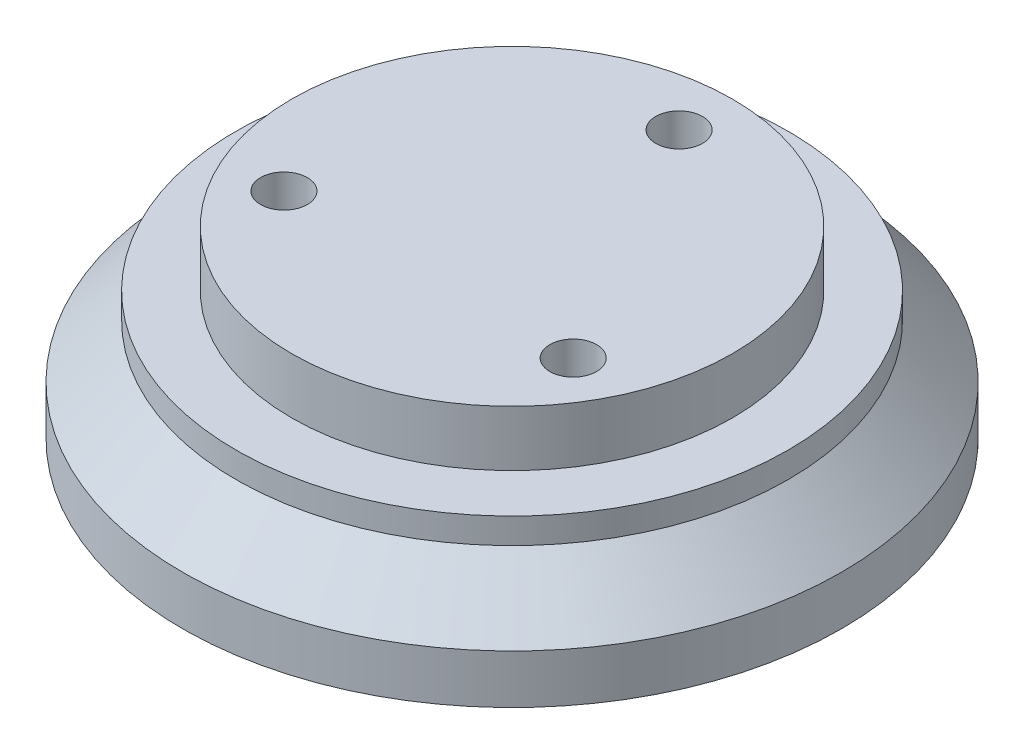
ISO-10303-21;
HEADER;
FILE_DESCRIPTION(('STEP AP214'),'2;1');
FILE_NAME('part.step','',(''),(''),'','','');
FILE_SCHEMA(('AUTOMOTIVE_DESIGN { 1 0 10303 214 1 1 1 1 }'));
ENDSEC;
DATA;
#1=APPLICATION_CONTEXT('core data for automotive mechanical design processes');
#2=APPLICATION_PROTOCOL_DEFINITION('international standard','automotive_design',2000,#1);
#3=PRODUCT_CONTEXT('',#1,'mechanical');
#4=PRODUCT('Part','Part','',(#3));
#5=PRODUCT_RELATED_PRODUCT_CATEGORY('part','',(#4));
#6=PRODUCT_DEFINITION_FORMATION('','',#4);
#7=PRODUCT_DEFINITION_CONTEXT('part definition',#1,'design');
#8=PRODUCT_DEFINITION('design','',#6,#7);
#9=PRODUCT_DEFINITION_SHAPE('','',#8);
#10=(LENGTH_UNIT() NAMED_UNIT(*) SI_UNIT(.MILLI.,.METRE.));
#11=(NAMED_UNIT(*) PLANE_ANGLE_UNIT() SI_UNIT($,.RADIAN.));
#12=(NAMED_UNIT(*) SI_UNIT($,.STERADIAN.) SOLID_ANGLE_UNIT());
#13=UNCERTAINTY_MEASURE_WITH_UNIT(LENGTH_MEASURE(1.E-05),#10,'distance_accuracy_value','');
#14=(GEOMETRIC_REPRESENTATION_CONTEXT(3) GLOBAL_UNCERTAINTY_ASSIGNED_CONTEXT((#13)) GLOBAL_UNIT_ASSIGNED_CONTEXT((#10,
#11,#12)) REPRESENTATION_CONTEXT('',''));
#15=CARTESIAN_POINT('',(0.,0.,0.));
#16=DIRECTION('',(0.,0.,1.));
#17=DIRECTION('',(1.,0.,0.));
#18=AXIS2_PLACEMENT_3D('',#15,#16,#17);
#19=CARTESIAN_POINT('',(12.9903810567665,-0.000999999999997531,7.50000000000006));
#20=DIRECTION('',(0.,1.,0.));
#21=DIRECTION('',(0.,0.,1.));
#22=AXIS2_PLACEMENT_3D('',#19,#20,#21);
#23=CYLINDRICAL_SURFACE('',#22,2.1);
#24=CARTESIAN_POINT('',(12.9903810567665,16.4999999999999,7.50000000000006));
#25=DIRECTION('',(0.,1.,0.));
#26=DIRECTION('',(0.,0.,1.));
#27=AXIS2_PLACEMENT_3D('',#24,#25,#26);
#28=CIRCLE('',#27,2.1);
#29=CARTESIAN_POINT('',(12.9903810567665,16.4999999999999,9.60000000000006));
#30=VERTEX_POINT('',#29);
#31=EDGE_CURVE('E319',#30,#30,#28,.T.);
#32=ORIENTED_EDGE('',*,*,#31,.T.);
#33=EDGE_LOOP('',(#32));
#34=FACE_BOUND('',#33,.T.);
#35=CARTESIAN_POINT('',(12.9903810567665,5.00000000000001,7.50000000000006));
#36=DIRECTION('',(0.,-1.,0.));
#37=DIRECTION('',(1.,0.,0.));
#38=AXIS2_PLACEMENT_3D('',#35,#36,#37);
#39=CIRCLE('',#38,2.1);
#40=CARTESIAN_POINT('',(15.0903810567665,5.00000000000001,7.50000000000006));
#41=VERTEX_POINT('',#40);
#42=EDGE_CURVE('E39',#41,#41,#39,.F.);
#43=ORIENTED_EDGE('',*,*,#42,.F.);
#44=EDGE_LOOP('',(#43));
#45=FACE_BOUND('',#44,.T.);
#46=ADVANCED_FACE('F35',(#34,#45),#23,.F.);
#47=CARTESIAN_POINT('',(-12.9903810567665,-0.000999999999997531,7.50000000000006));
#48=DIRECTION('',(0.,1.,0.));
#49=DIRECTION('',(0.,0.,1.));
#50=AXIS2_PLACEMENT_3D('',#47,#48,#49);
#51=CYLINDRICAL_SURFACE('',#50,2.1);
#52=CARTESIAN_POINT('',(-12.9903810567665,16.4999999999999,7.50000000000006));
#53=DIRECTION('',(0.,1.,0.));
#54=DIRECTION('',(0.,0.,1.));
#55=AXIS2_PLACEMENT_3D('',#52,#53,#54);
#56=CIRCLE('',#55,2.1);
#57=CARTESIAN_POINT('',(-12.9903810567665,16.4999999999999,9.60000000000006));
#58=VERTEX_POINT('',#57);
#59=EDGE_CURVE('E316',#58,#58,#56,.T.);
#60=ORIENTED_EDGE('',*,*,#59,.T.);
#61=EDGE_LOOP('',(#60));
#62=FACE_BOUND('',#61,.T.);
#63=CARTESIAN_POINT('',(-12.9903810567665,4.99999999999999,7.50000000000006));
#64=DIRECTION('',(0.,-1.,0.));
#65=DIRECTION('',(1.,0.,0.));
#66=AXIS2_PLACEMENT_3D('',#63,#64,#65);
#67=CIRCLE('',#66,2.1);
#68=CARTESIAN_POINT('',(-10.8903810567665,5.,7.50000000000006));
#69=VERTEX_POINT('',#68);
#70=EDGE_CURVE('E336',#69,#69,#67,.F.);
#71=ORIENTED_EDGE('',*,*,#70,.F.);
#72=EDGE_LOOP('',(#71));
#73=FACE_BOUND('',#72,.T.);
#74=ADVANCED_FACE('F345',(#62,#73),#51,.F.);
#75=CARTESIAN_POINT('',(0.,-0.000999999999997531,-15.));
#76=DIRECTION('',(0.,1.,0.));
#77=DIRECTION('',(0.,0.,1.));
#78=AXIS2_PLACEMENT_3D('',#75,#76,#77);
#79=CYLINDRICAL_SURFACE('',#78,2.1);
#80=CARTESIAN_POINT('',(0.,16.4999999999999,-15.));
#81=DIRECTION('',(0.,1.,0.));
#82=DIRECTION('',(0.,0.,1.));
#83=AXIS2_PLACEMENT_3D('',#80,#81,#82);
#84=CIRCLE('',#83,2.1);
#85=CARTESIAN_POINT('',(0.,16.4999999999999,-12.9));
#86=VERTEX_POINT('',#85);
#87=EDGE_CURVE('E312',#86,#86,#84,.T.);
#88=ORIENTED_EDGE('',*,*,#87,.T.);
#89=EDGE_LOOP('',(#88));
#90=FACE_BOUND('',#89,.T.);
#91=CARTESIAN_POINT('',(0.,5.,-15.));
#92=DIRECTION('',(0.,-1.,0.));
#93=DIRECTION('',(1.,0.,0.));
#94=AXIS2_PLACEMENT_3D('',#91,#92,#93);
#95=CIRCLE('',#94,2.1);
#96=CARTESIAN_POINT('',(2.1,5.,-15.));
#97=VERTEX_POINT('',#96);
#98=EDGE_CURVE('E211',#97,#97,#95,.F.);
#99=ORIENTED_EDGE('',*,*,#98,.F.);
#100=EDGE_LOOP('',(#99));
#101=FACE_BOUND('',#100,.T.);
#102=ADVANCED_FACE('F351',(#90,#101),#79,.F.);
#103=CARTESIAN_POINT('',(0.,16.4999999999999,0.));
#104=DIRECTION('',(0.,1.,0.));
#105=DIRECTION('',(-1.,0.,0.));
#106=AXIS2_PLACEMENT_3D('',#103,#104,#105);
#107=PLANE('',#106);
#108=ORIENTED_EDGE('',*,*,#87,.F.);
#109=EDGE_LOOP('',(#108));
#110=FACE_BOUND('',#109,.T.);
#111=ORIENTED_EDGE('',*,*,#59,.F.);
#112=EDGE_LOOP('',(#111));
#113=FACE_BOUND('',#112,.T.);
#114=ORIENTED_EDGE('',*,*,#31,.F.);
#115=EDGE_LOOP('',(#114));
#116=FACE_BOUND('',#115,.T.);
#117=CARTESIAN_POINT('',(0.,16.4999999999999,0.));
#118=DIRECTION('',(0.,-1.,0.));
#119=DIRECTION('',(1.,0.,0.));
#120=AXIS2_PLACEMENT_3D('',#117,#118,#119);
#121=CIRCLE('',#120,19.8);
#122=CARTESIAN_POINT('',(19.8,16.4999999999999,0.));
#123=VERTEX_POINT('',#122);
#124=EDGE_CURVE('E11',#123,#123,#121,.T.);
#125=ORIENTED_EDGE('',*,*,#124,.F.);
#126=EDGE_LOOP('',(#125));
#127=FACE_BOUND('',#126,.T.);
#128=ADVANCED_FACE('F37',(#110,#113,#116,#127),#107,.T.);
#129=CARTESIAN_POINT('',(0.,0.,0.));
#130=DIRECTION('',(0.,-1.,0.));
#131=DIRECTION('',(1.,0.,0.));
#132=AXIS2_PLACEMENT_3D('',#129,#130,#131);
#133=CYLINDRICAL_SURFACE('',#132,19.8);
#134=ORIENTED_EDGE('',*,*,#124,.T.);
#135=EDGE_LOOP('',(#134));
#136=FACE_BOUND('',#135,.T.);
#137=CARTESIAN_POINT('',(0.,11.4999999999999,0.));
#138=DIRECTION('',(0.,-1.,0.));
#139=DIRECTION('',(1.,0.,0.));
#140=AXIS2_PLACEMENT_3D('',#137,#138,#139);
#141=CIRCLE('',#140,19.8);
#142=CARTESIAN_POINT('',(19.8,11.4999999999999,0.));
#143=VERTEX_POINT('',#142);
#144=EDGE_CURVE('E44',#143,#143,#141,.T.);
#145=ORIENTED_EDGE('',*,*,#144,.F.);
#146=EDGE_LOOP('',(#145));
#147=FACE_BOUND('',#146,.T.);
#148=ADVANCED_FACE('F375',(#136,#147),#133,.T.);
#149=CARTESIAN_POINT('',(24.8,11.4999999999999,0.));
#150=DIRECTION('',(0.,1.,0.));
#151=DIRECTION('',(-1.,0.,0.));
#152=AXIS2_PLACEMENT_3D('',#149,#150,#151);
#153=PLANE('',#152);
#154=ORIENTED_EDGE('',*,*,#144,.T.);
#155=EDGE_LOOP('',(#154));
#156=FACE_BOUND('',#155,.T.);
#157=CARTESIAN_POINT('',(0.,11.4999999999999,0.));
#158=DIRECTION('',(0.,-1.,0.));
#159=DIRECTION('',(1.,0.,0.));
#160=AXIS2_PLACEMENT_3D('',#157,#158,#159);
#161=CIRCLE('',#160,24.8);
#162=CARTESIAN_POINT('',(24.8,11.4999999999999,0.));
#163=VERTEX_POINT('',#162);
#164=EDGE_CURVE('E330',#163,#163,#161,.T.);
#165=ORIENTED_EDGE('',*,*,#164,.F.);
#166=EDGE_LOOP('',(#165));
#167=FACE_BOUND('',#166,.T.);
#168=ADVANCED_FACE('F372',(#156,#167),#153,.T.);
#169=CARTESIAN_POINT('',(0.,0.,0.));
#170=DIRECTION('',(0.,-1.,0.));
#171=DIRECTION('',(1.,0.,0.));
#172=AXIS2_PLACEMENT_3D('',#169,#170,#171);
#173=CYLINDRICAL_SURFACE('',#172,24.8);
#174=ORIENTED_EDGE('',*,*,#164,.T.);
#175=EDGE_LOOP('',(#174));
#176=FACE_BOUND('',#175,.T.);
#177=CARTESIAN_POINT('',(0.,9.19999999999988,0.));
#178=DIRECTION('',(0.,-1.,0.));
#179=DIRECTION('',(1.,0.,0.));
#180=AXIS2_PLACEMENT_3D('',#177,#178,#179);
#181=CIRCLE('',#180,24.8);
#182=CARTESIAN_POINT('',(24.8,9.19999999999988,0.));
#183=VERTEX_POINT('',#182);
#184=EDGE_CURVE('E327',#183,#183,#181,.T.);
#185=ORIENTED_EDGE('',*,*,#184,.F.);
#186=EDGE_LOOP('',(#185));
#187=FACE_BOUND('',#186,.T.);
#188=ADVANCED_FACE('F368',(#176,#187),#173,.T.);
#189=CARTESIAN_POINT('',(0.,4.4,0.));
#190=DIRECTION('',(0.,-1.,0.));
#191=DIRECTION('',(1.,0.,0.));
#192=AXIS2_PLACEMENT_3D('',#189,#190,#191);
#193=CONICAL_SURFACE('',#192,29.6,0.785398163397461);
#194=ORIENTED_EDGE('',*,*,#184,.T.);
#195=EDGE_LOOP('',(#194));
#196=FACE_BOUND('',#195,.T.);
#197=CARTESIAN_POINT('',(0.,4.4,0.));
#198=DIRECTION('',(0.,-1.,0.));
#199=DIRECTION('',(1.,0.,0.));
#200=AXIS2_PLACEMENT_3D('',#197,#198,#199);
#201=CIRCLE('',#200,29.6);
#202=CARTESIAN_POINT('',(29.6,4.4,0.));
#203=VERTEX_POINT('',#202);
#204=EDGE_CURVE('E324',#203,#203,#201,.T.);
#205=ORIENTED_EDGE('',*,*,#204,.F.);
#206=EDGE_LOOP('',(#205));
#207=FACE_BOUND('',#206,.T.);
#208=ADVANCED_FACE('F364',(#196,#207),#193,.T.);
#209=CARTESIAN_POINT('',(0.,0.,0.));
#210=DIRECTION('',(0.,-1.,0.));
#211=DIRECTION('',(1.,0.,0.));
#212=AXIS2_PLACEMENT_3D('',#209,#210,#211);
#213=CYLINDRICAL_SURFACE('',#212,29.6);
#214=ORIENTED_EDGE('',*,*,#204,.T.);
#215=EDGE_LOOP('',(#214));
#216=FACE_BOUND('',#215,.T.);
#217=CARTESIAN_POINT('',(0.,0.,0.));
#218=DIRECTION('',(0.,-1.,0.));
#219=DIRECTION('',(1.,0.,0.));
#220=AXIS2_PLACEMENT_3D('',#217,#218,#219);
#221=CIRCLE('',#220,29.6);
#222=CARTESIAN_POINT('',(29.6,0.,0.));
#223=VERTEX_POINT('',#222);
#224=EDGE_CURVE('E315',#223,#223,#221,.T.);
#225=ORIENTED_EDGE('',*,*,#224,.F.);
#226=EDGE_LOOP('',(#225));
#227=FACE_BOUND('',#226,.T.);
#228=ADVANCED_FACE('F360',(#216,#227),#213,.T.);
#229=CARTESIAN_POINT('',(29.6,0.,0.));
#230=DIRECTION('',(0.,-1.,0.));
#231=DIRECTION('',(1.,0.,0.));
#232=AXIS2_PLACEMENT_3D('',#229,#230,#231);
#233=PLANE('',#232);
#234=DIRECTION('',(-0.5,0.,0.866025403784439));
#235=VECTOR('',#234,1.);
#236=CARTESIAN_POINT('',(-8.71798906476331,0.,7.50000000000007));
#237=LINE('',#236,#235);
#238=CARTESIAN_POINT('',(-8.71798906476331,0.,7.50000000000007));
#239=VERTEX_POINT('',#238);
#240=CARTESIAN_POINT('',(-10.8541850607649,0.,11.2000000000001));
#241=VERTEX_POINT('',#240);
#242=EDGE_CURVE('E52',#239,#241,#237,.T.);
#243=ORIENTED_EDGE('',*,*,#242,.F.);
#244=DIRECTION('',(0.5,0.,0.866025403784439));
#245=VECTOR('',#244,1.);
#246=CARTESIAN_POINT('',(-10.8541850607649,0.,3.80000000000006));
#247=LINE('',#246,#245);
#248=CARTESIAN_POINT('',(-10.8541850607649,0.,3.80000000000006));
#249=VERTEX_POINT('',#248);
#250=EDGE_CURVE('E184',#249,#239,#247,.T.);
#251=ORIENTED_EDGE('',*,*,#250,.F.);
#252=DIRECTION('',(1.,0.,0.));
#253=VECTOR('',#252,1.);
#254=CARTESIAN_POINT('',(-15.1265770527682,0.,3.80000000000006));
#255=LINE('',#254,#253);
#256=CARTESIAN_POINT('',(-15.1265770527682,0.,3.80000000000006));
#257=VERTEX_POINT('',#256);
#258=EDGE_CURVE('E187',#257,#249,#255,.T.);
#259=ORIENTED_EDGE('',*,*,#258,.F.);
#260=DIRECTION('',(0.5,0.,-0.866025403784439));
#261=VECTOR('',#260,1.);
#262=CARTESIAN_POINT('',(-17.2627730487698,0.,7.50000000000006));
#263=LINE('',#262,#261);
#264=CARTESIAN_POINT('',(-17.2627730487698,0.,7.50000000000006));
#265=VERTEX_POINT('',#264);
#266=EDGE_CURVE('E204',#265,#257,#263,.T.);
#267=ORIENTED_EDGE('',*,*,#266,.F.);
#268=DIRECTION('',(-0.5,0.,-0.866025403784439));
#269=VECTOR('',#268,1.);
#270=CARTESIAN_POINT('',(-15.1265770527682,0.,11.2000000000001));
#271=LINE('',#270,#269);
#272=CARTESIAN_POINT('',(-15.1265770527682,0.,11.2000000000001));
#273=VERTEX_POINT('',#272);
#274=EDGE_CURVE('E201',#273,#265,#271,.T.);
#275=ORIENTED_EDGE('',*,*,#274,.F.);
#276=DIRECTION('',(-1.,0.,0.));
#277=VECTOR('',#276,1.);
#278=CARTESIAN_POINT('',(-10.8541850607649,0.,11.2000000000001));
#279=LINE('',#278,#277);
#280=EDGE_CURVE('E198',#241,#273,#279,.T.);
#281=ORIENTED_EDGE('',*,*,#280,.F.);
#282=EDGE_LOOP('',(#243,#251,#259,#267,#275,#281));
#283=FACE_BOUND('',#282,.T.);
#284=DIRECTION('',(-0.5,0.,0.866025403784438));
#285=VECTOR('',#284,1.);
#286=CARTESIAN_POINT('',(17.2627730487698,0.,7.50000000000006));
#287=LINE('',#286,#285);
#288=CARTESIAN_POINT('',(17.2627730487698,0.,7.50000000000006));
#289=VERTEX_POINT('',#288);
#290=CARTESIAN_POINT('',(15.1265770527682,0.,11.2000000000001));
#291=VERTEX_POINT('',#290);
#292=EDGE_CURVE('E60',#289,#291,#287,.T.);
#293=ORIENTED_EDGE('',*,*,#292,.F.);
#294=DIRECTION('',(0.5,0.,0.866025403784438));
#295=VECTOR('',#294,1.);
#296=CARTESIAN_POINT('',(15.1265770527682,0.,3.80000000000007));
#297=LINE('',#296,#295);
#298=CARTESIAN_POINT('',(15.1265770527682,0.,3.80000000000007));
#299=VERTEX_POINT('',#298);
#300=EDGE_CURVE('E223',#299,#289,#297,.T.);
#301=ORIENTED_EDGE('',*,*,#300,.F.);
#302=DIRECTION('',(1.,0.,0.));
#303=VECTOR('',#302,1.);
#304=CARTESIAN_POINT('',(10.8541850607649,0.,3.80000000000007));
#305=LINE('',#304,#303);
#306=CARTESIAN_POINT('',(10.8541850607649,0.,3.80000000000007));
#307=VERTEX_POINT('',#306);
#308=EDGE_CURVE('E250',#307,#299,#305,.T.);
#309=ORIENTED_EDGE('',*,*,#308,.F.);
#310=DIRECTION('',(0.500000000000001,0.,-0.866025403784438));
#311=VECTOR('',#310,1.);
#312=CARTESIAN_POINT('',(8.71798906476332,0.,7.50000000000006));
#313=LINE('',#312,#311);
#314=CARTESIAN_POINT('',(8.71798906476332,0.,7.50000000000006));
#315=VERTEX_POINT('',#314);
#316=EDGE_CURVE('E247',#315,#307,#313,.T.);
#317=ORIENTED_EDGE('',*,*,#316,.F.);
#318=DIRECTION('',(-0.5,0.,-0.866025403784439));
#319=VECTOR('',#318,1.);
#320=CARTESIAN_POINT('',(10.8541850607649,0.,11.2000000000001));
#321=LINE('',#320,#319);
#322=CARTESIAN_POINT('',(10.8541850607649,0.,11.2000000000001));
#323=VERTEX_POINT('',#322);
#324=EDGE_CURVE('E244',#323,#315,#321,.T.);
#325=ORIENTED_EDGE('',*,*,#324,.F.);
#326=DIRECTION('',(-1.,0.,0.));
#327=VECTOR('',#326,1.);
#328=CARTESIAN_POINT('',(15.1265770527682,0.,11.2000000000001));
#329=LINE('',#328,#327);
#330=EDGE_CURVE('E240',#291,#323,#329,.T.);
#331=ORIENTED_EDGE('',*,*,#330,.F.);
#332=EDGE_LOOP('',(#293,#301,#309,#317,#325,#331));
#333=FACE_BOUND('',#332,.T.);
#334=DIRECTION('',(-0.5,0.,0.866025403784438));
#335=VECTOR('',#334,1.);
#336=CARTESIAN_POINT('',(4.27239199200323,0.,-15.));
#337=LINE('',#336,#335);
#338=CARTESIAN_POINT('',(4.27239199200323,0.,-15.));
#339=VERTEX_POINT('',#338);
#340=CARTESIAN_POINT('',(2.13619599600161,0.,-11.3));
#341=VERTEX_POINT('',#340);
#342=EDGE_CURVE('E285',#339,#341,#337,.T.);
#343=ORIENTED_EDGE('',*,*,#342,.F.);
#344=DIRECTION('',(0.5,0.,0.866025403784439));
#345=VECTOR('',#344,1.);
#346=CARTESIAN_POINT('',(2.13619599600161,0.,-18.7));
#347=LINE('',#346,#345);
#348=CARTESIAN_POINT('',(2.13619599600161,0.,-18.7));
#349=VERTEX_POINT('',#348);
#350=EDGE_CURVE('E269',#349,#339,#347,.T.);
#351=ORIENTED_EDGE('',*,*,#350,.F.);
#352=DIRECTION('',(1.,0.,0.));
#353=VECTOR('',#352,1.);
#354=CARTESIAN_POINT('',(-2.13619599600162,0.,-18.7));
#355=LINE('',#354,#353);
#356=CARTESIAN_POINT('',(-2.13619599600162,0.,-18.7));
#357=VERTEX_POINT('',#356);
#358=EDGE_CURVE('E296',#357,#349,#355,.T.);
#359=ORIENTED_EDGE('',*,*,#358,.F.);
#360=DIRECTION('',(0.5,0.,-0.866025403784439));
#361=VECTOR('',#360,1.);
#362=CARTESIAN_POINT('',(-4.27239199200324,0.,-15.));
#363=LINE('',#362,#361);
#364=CARTESIAN_POINT('',(-4.27239199200324,0.,-15.));
#365=VERTEX_POINT('',#364);
#366=EDGE_CURVE('E293',#365,#357,#363,.T.);
#367=ORIENTED_EDGE('',*,*,#366,.F.);
#368=DIRECTION('',(-0.5,0.,-0.866025403784439));
#369=VECTOR('',#368,1.);
#370=CARTESIAN_POINT('',(-2.13619599600163,0.,-11.3));
#371=LINE('',#370,#369);
#372=CARTESIAN_POINT('',(-2.13619599600163,0.,-11.3));
#373=VERTEX_POINT('',#372);
#374=EDGE_CURVE('E290',#373,#365,#371,.T.);
#375=ORIENTED_EDGE('',*,*,#374,.F.);
#376=DIRECTION('',(-1.,0.,0.));
#377=VECTOR('',#376,1.);
#378=CARTESIAN_POINT('',(2.13619599600161,0.,-11.3));
#379=LINE('',#378,#377);
#380=EDGE_CURVE('E287',#341,#373,#379,.T.);
#381=ORIENTED_EDGE('',*,*,#380,.F.);
#382=EDGE_LOOP('',(#343,#351,#359,#367,#375,#381));
#383=FACE_BOUND('',#382,.T.);
#384=ORIENTED_EDGE('',*,*,#224,.T.);
#385=EDGE_LOOP('',(#384));
#386=FACE_BOUND('',#385,.T.);
#387=ADVANCED_FACE('F356',(#283,#333,#383,#386),#233,.T.);
#388=CARTESIAN_POINT('',(0.,5.,0.));
#389=DIRECTION('',(0.,-1.,0.));
#390=DIRECTION('',(1.,0.,0.));
#391=AXIS2_PLACEMENT_3D('',#388,#389,#390);
#392=PLANE('',#391);
#393=DIRECTION('',(-0.5,0.,0.866025403784438));
#394=VECTOR('',#393,1.);
#395=CARTESIAN_POINT('',(4.27239199200322,5.,-15.));
#396=LINE('',#395,#394);
#397=CARTESIAN_POINT('',(4.27239199200322,5.,-15.));
#398=VERTEX_POINT('',#397);
#399=CARTESIAN_POINT('',(2.13619599600161,5.,-11.3));
#400=VERTEX_POINT('',#399);
#401=EDGE_CURVE('E265',#398,#400,#396,.T.);
#402=ORIENTED_EDGE('',*,*,#401,.T.);
#403=DIRECTION('',(-1.,0.,0.));
#404=VECTOR('',#403,1.);
#405=CARTESIAN_POINT('',(2.13619599600161,5.,-11.3));
#406=LINE('',#405,#404);
#407=CARTESIAN_POINT('',(-2.13619599600163,5.,-11.3));
#408=VERTEX_POINT('',#407);
#409=EDGE_CURVE('E268',#400,#408,#406,.T.);
#410=ORIENTED_EDGE('',*,*,#409,.T.);
#411=DIRECTION('',(-0.5,0.,-0.866025403784439));
#412=VECTOR('',#411,1.);
#413=CARTESIAN_POINT('',(-2.13619599600163,5.,-11.3));
#414=LINE('',#413,#412);
#415=CARTESIAN_POINT('',(-4.27239199200324,5.,-15.));
#416=VERTEX_POINT('',#415);
#417=EDGE_CURVE('E272',#408,#416,#414,.T.);
#418=ORIENTED_EDGE('',*,*,#417,.T.);
#419=DIRECTION('',(0.5,0.,-0.866025403784439));
#420=VECTOR('',#419,1.);
#421=CARTESIAN_POINT('',(-4.27239199200324,5.,-15.));
#422=LINE('',#421,#420);
#423=CARTESIAN_POINT('',(-2.13619599600162,5.,-18.7));
#424=VERTEX_POINT('',#423);
#425=EDGE_CURVE('E275',#416,#424,#422,.T.);
#426=ORIENTED_EDGE('',*,*,#425,.T.);
#427=DIRECTION('',(1.,0.,0.));
#428=VECTOR('',#427,1.);
#429=CARTESIAN_POINT('',(-2.13619599600162,5.,-18.7));
#430=LINE('',#429,#428);
#431=CARTESIAN_POINT('',(2.13619599600161,5.,-18.7));
#432=VERTEX_POINT('',#431);
#433=EDGE_CURVE('E278',#424,#432,#430,.T.);
#434=ORIENTED_EDGE('',*,*,#433,.T.);
#435=DIRECTION('',(0.5,0.,0.866025403784439));
#436=VECTOR('',#435,1.);
#437=CARTESIAN_POINT('',(2.13619599600161,5.,-18.7));
#438=LINE('',#437,#436);
#439=EDGE_CURVE('E281',#432,#398,#438,.T.);
#440=ORIENTED_EDGE('',*,*,#439,.T.);
#441=EDGE_LOOP('',(#402,#410,#418,#426,#434,#440));
#442=FACE_BOUND('',#441,.T.);
#443=ORIENTED_EDGE('',*,*,#98,.T.);
#444=EDGE_LOOP('',(#443));
#445=FACE_BOUND('',#444,.T.);
#446=ADVANCED_FACE('F359',(#442,#445),#392,.T.);
#447=CARTESIAN_POINT('',(4.27239199200322,5.,-15.));
#448=DIRECTION('',(0.866025403784439,0.,0.5));
#449=DIRECTION('',(0.5,0.,-0.866025403784439));
#450=AXIS2_PLACEMENT_3D('',#447,#448,#449);
#451=PLANE('',#450);
#452=ORIENTED_EDGE('',*,*,#342,.T.);
#453=DIRECTION('',(0.,-1.,0.));
#454=VECTOR('',#453,1.);
#455=CARTESIAN_POINT('',(2.13619599600161,5.,-11.3));
#456=LINE('',#455,#454);
#457=EDGE_CURVE('E284',#400,#341,#456,.T.);
#458=ORIENTED_EDGE('',*,*,#457,.F.);
#459=ORIENTED_EDGE('',*,*,#401,.F.);
#460=DIRECTION('',(0.,-1.,0.));
#461=VECTOR('',#460,1.);
#462=CARTESIAN_POINT('',(4.27239199200322,5.,-15.));
#463=LINE('',#462,#461);
#464=EDGE_CURVE('E241',#398,#339,#463,.T.);
#465=ORIENTED_EDGE('',*,*,#464,.T.);
#466=EDGE_LOOP('',(#452,#458,#459,#465));
#467=FACE_BOUND('',#466,.T.);
#468=ADVANCED_FACE('F410',(#467),#451,.F.);
#469=CARTESIAN_POINT('',(2.13619599600161,5.,-18.7));
#470=DIRECTION('',(0.866025403784439,0.,-0.5));
#471=DIRECTION('',(-0.5,0.,-0.866025403784439));
#472=AXIS2_PLACEMENT_3D('',#469,#470,#471);
#473=PLANE('',#472);
#474=ORIENTED_EDGE('',*,*,#350,.T.);
#475=ORIENTED_EDGE('',*,*,#464,.F.);
#476=ORIENTED_EDGE('',*,*,#439,.F.);
#477=DIRECTION('',(0.,-1.,0.));
#478=VECTOR('',#477,1.);
#479=CARTESIAN_POINT('',(2.13619599600161,5.,-18.7));
#480=LINE('',#479,#478);
#481=EDGE_CURVE('E302',#432,#349,#480,.T.);
#482=ORIENTED_EDGE('',*,*,#481,.T.);
#483=EDGE_LOOP('',(#474,#475,#476,#482));
#484=FACE_BOUND('',#483,.T.);
#485=ADVANCED_FACE('F416',(#484),#473,.F.);
#486=CARTESIAN_POINT('',(-2.13619599600162,5.,-18.7));
#487=DIRECTION('',(0.,0.,-1.));
#488=DIRECTION('',(-1.,0.,0.));
#489=AXIS2_PLACEMENT_3D('',#486,#487,#488);
#490=PLANE('',#489);
#491=ORIENTED_EDGE('',*,*,#358,.T.);
#492=ORIENTED_EDGE('',*,*,#481,.F.);
#493=ORIENTED_EDGE('',*,*,#433,.F.);
#494=DIRECTION('',(0.,-1.,0.));
#495=VECTOR('',#494,1.);
#496=CARTESIAN_POINT('',(-2.13619599600162,5.,-18.7));
#497=LINE('',#496,#495);
#498=EDGE_CURVE('E304',#424,#357,#497,.T.);
#499=ORIENTED_EDGE('',*,*,#498,.T.);
#500=EDGE_LOOP('',(#491,#492,#493,#499));
#501=FACE_BOUND('',#500,.T.);
#502=ADVANCED_FACE('F425',(#501),#490,.F.);
#503=CARTESIAN_POINT('',(-4.27239199200324,5.,-15.));
#504=DIRECTION('',(-0.866025403784438,0.,-0.5));
#505=DIRECTION('',(-0.5,0.,0.866025403784439));
#506=AXIS2_PLACEMENT_3D('',#503,#504,#505);
#507=PLANE('',#506);
#508=ORIENTED_EDGE('',*,*,#366,.T.);
#509=ORIENTED_EDGE('',*,*,#498,.F.);
#510=ORIENTED_EDGE('',*,*,#425,.F.);
#511=DIRECTION('',(0.,-1.,0.));
#512=VECTOR('',#511,1.);
#513=CARTESIAN_POINT('',(-4.27239199200324,5.,-15.));
#514=LINE('',#513,#512);
#515=EDGE_CURVE('E306',#416,#365,#514,.T.);
#516=ORIENTED_EDGE('',*,*,#515,.T.);
#517=EDGE_LOOP('',(#508,#509,#510,#516));
#518=FACE_BOUND('',#517,.T.);
#519=ADVANCED_FACE('F429',(#518),#507,.F.);
#520=CARTESIAN_POINT('',(-2.13619599600163,5.,-11.3));
#521=DIRECTION('',(-0.866025403784439,0.,0.5));
#522=DIRECTION('',(0.5,0.,0.866025403784439));
#523=AXIS2_PLACEMENT_3D('',#520,#521,#522);
#524=PLANE('',#523);
#525=ORIENTED_EDGE('',*,*,#374,.T.);
#526=ORIENTED_EDGE('',*,*,#515,.F.);
#527=ORIENTED_EDGE('',*,*,#417,.F.);
#528=DIRECTION('',(0.,-1.,0.));
#529=VECTOR('',#528,1.);
#530=CARTESIAN_POINT('',(-2.13619599600163,5.,-11.3));
#531=LINE('',#530,#529);
#532=EDGE_CURVE('E308',#408,#373,#531,.T.);
#533=ORIENTED_EDGE('',*,*,#532,.T.);
#534=EDGE_LOOP('',(#525,#526,#527,#533));
#535=FACE_BOUND('',#534,.T.);
#536=ADVANCED_FACE('F433',(#535),#524,.F.);
#537=CARTESIAN_POINT('',(2.13619599600161,5.,-11.3));
#538=DIRECTION('',(0.,0.,1.));
#539=DIRECTION('',(1.,0.,0.));
#540=AXIS2_PLACEMENT_3D('',#537,#538,#539);
#541=PLANE('',#540);
#542=ORIENTED_EDGE('',*,*,#380,.T.);
#543=ORIENTED_EDGE('',*,*,#532,.F.);
#544=ORIENTED_EDGE('',*,*,#409,.F.);
#545=ORIENTED_EDGE('',*,*,#457,.T.);
#546=EDGE_LOOP('',(#542,#543,#544,#545));
#547=FACE_BOUND('',#546,.T.);
#548=ADVANCED_FACE('F437',(#547),#541,.F.);
#549=CARTESIAN_POINT('',(0.,5.,0.));
#550=DIRECTION('',(0.,-1.,0.));
#551=DIRECTION('',(1.,0.,0.));
#552=AXIS2_PLACEMENT_3D('',#549,#550,#551);
#553=PLANE('',#552);
#554=DIRECTION('',(-0.5,0.,0.866025403784439));
#555=VECTOR('',#554,1.);
#556=CARTESIAN_POINT('',(-8.71798906476331,5.,7.50000000000007));
#557=LINE('',#556,#555);
#558=CARTESIAN_POINT('',(-8.71798906476331,5.,7.50000000000007));
#559=VERTEX_POINT('',#558);
#560=CARTESIAN_POINT('',(-10.8541850607649,5.,11.2000000000001));
#561=VERTEX_POINT('',#560);
#562=EDGE_CURVE('E164',#559,#561,#557,.T.);
#563=ORIENTED_EDGE('',*,*,#562,.T.);
#564=DIRECTION('',(-1.,0.,0.));
#565=VECTOR('',#564,1.);
#566=CARTESIAN_POINT('',(-10.8541850607649,5.,11.2000000000001));
#567=LINE('',#566,#565);
#568=CARTESIAN_POINT('',(-15.1265770527682,4.99999999999999,11.2000000000001));
#569=VERTEX_POINT('',#568);
#570=EDGE_CURVE('E173',#561,#569,#567,.T.);
#571=ORIENTED_EDGE('',*,*,#570,.T.);
#572=DIRECTION('',(-0.5,0.,-0.866025403784439));
#573=VECTOR('',#572,1.);
#574=CARTESIAN_POINT('',(-15.1265770527682,4.99999999999999,11.2000000000001));
#575=LINE('',#574,#573);
#576=CARTESIAN_POINT('',(-17.2627730487698,4.99999999999999,7.50000000000006));
#577=VERTEX_POINT('',#576);
#578=EDGE_CURVE('E178',#569,#577,#575,.T.);
#579=ORIENTED_EDGE('',*,*,#578,.T.);
#580=DIRECTION('',(0.5,0.,-0.866025403784439));
#581=VECTOR('',#580,1.);
#582=CARTESIAN_POINT('',(-17.2627730487698,4.99999999999999,7.50000000000006));
#583=LINE('',#582,#581);
#584=CARTESIAN_POINT('',(-15.1265770527682,4.99999999999999,3.80000000000006));
#585=VERTEX_POINT('',#584);
#586=EDGE_CURVE('E191',#577,#585,#583,.T.);
#587=ORIENTED_EDGE('',*,*,#586,.T.);
#588=DIRECTION('',(1.,0.,0.));
#589=VECTOR('',#588,1.);
#590=CARTESIAN_POINT('',(-15.1265770527682,4.99999999999999,3.80000000000006));
#591=LINE('',#590,#589);
#592=CARTESIAN_POINT('',(-10.8541850607649,5.,3.80000000000006));
#593=VERTEX_POINT('',#592);
#594=EDGE_CURVE('E194',#585,#593,#591,.T.);
#595=ORIENTED_EDGE('',*,*,#594,.T.);
#596=DIRECTION('',(0.5,0.,0.866025403784439));
#597=VECTOR('',#596,1.);
#598=CARTESIAN_POINT('',(-10.8541850607649,5.,3.80000000000006));
#599=LINE('',#598,#597);
#600=EDGE_CURVE('E170',#593,#559,#599,.T.);
#601=ORIENTED_EDGE('',*,*,#600,.T.);
#602=EDGE_LOOP('',(#563,#571,#579,#587,#595,#601));
#603=FACE_BOUND('',#602,.T.);
#604=ORIENTED_EDGE('',*,*,#70,.T.);
#605=EDGE_LOOP('',(#604));
#606=FACE_BOUND('',#605,.T.);
#607=ADVANCED_FACE('F180',(#603,#606),#553,.T.);
#608=CARTESIAN_POINT('',(-8.71798906476331,5.,7.50000000000007));
#609=DIRECTION('',(0.866025403784439,0.,0.5));
#610=DIRECTION('',(0.5,0.,-0.866025403784439));
#611=AXIS2_PLACEMENT_3D('',#608,#609,#610);
#612=PLANE('',#611);
#613=ORIENTED_EDGE('',*,*,#242,.T.);
#614=DIRECTION('',(0.,-1.,0.));
#615=VECTOR('',#614,1.);
#616=CARTESIAN_POINT('',(-10.8541850607649,5.,11.2000000000001));
#617=LINE('',#616,#615);
#618=EDGE_CURVE('E160',#561,#241,#617,.T.);
#619=ORIENTED_EDGE('',*,*,#618,.F.);
#620=ORIENTED_EDGE('',*,*,#562,.F.);
#621=DIRECTION('',(0.,-1.,0.));
#622=VECTOR('',#621,1.);
#623=CARTESIAN_POINT('',(-8.71798906476331,5.,7.50000000000007));
#624=LINE('',#623,#622);
#625=EDGE_CURVE('E209',#559,#239,#624,.T.);
#626=ORIENTED_EDGE('',*,*,#625,.T.);
#627=EDGE_LOOP('',(#613,#619,#620,#626));
#628=FACE_BOUND('',#627,.T.);
#629=ADVANCED_FACE('F162',(#628),#612,.F.);
#630=CARTESIAN_POINT('',(-10.8541850607649,5.,3.80000000000006));
#631=DIRECTION('',(0.866025403784439,0.,-0.5));
#632=DIRECTION('',(-0.5,0.,-0.866025403784439));
#633=AXIS2_PLACEMENT_3D('',#630,#631,#632);
#634=PLANE('',#633);
#635=ORIENTED_EDGE('',*,*,#250,.T.);
#636=ORIENTED_EDGE('',*,*,#625,.F.);
#637=ORIENTED_EDGE('',*,*,#600,.F.);
#638=DIRECTION('',(0.,-1.,0.));
#639=VECTOR('',#638,1.);
#640=CARTESIAN_POINT('',(-10.8541850607649,5.,3.80000000000006));
#641=LINE('',#640,#639);
#642=EDGE_CURVE('E212',#593,#249,#641,.T.);
#643=ORIENTED_EDGE('',*,*,#642,.T.);
#644=EDGE_LOOP('',(#635,#636,#637,#643));
#645=FACE_BOUND('',#644,.T.);
#646=ADVANCED_FACE('F461',(#645),#634,.F.);
#647=CARTESIAN_POINT('',(-15.1265770527682,4.99999999999999,3.80000000000006));
#648=DIRECTION('',(0.,0.,-1.));
#649=DIRECTION('',(-1.,0.,0.));
#650=AXIS2_PLACEMENT_3D('',#647,#648,#649);
#651=PLANE('',#650);
#652=ORIENTED_EDGE('',*,*,#258,.T.);
#653=ORIENTED_EDGE('',*,*,#642,.F.);
#654=ORIENTED_EDGE('',*,*,#594,.F.);
#655=DIRECTION('',(0.,-1.,0.));
#656=VECTOR('',#655,1.);
#657=CARTESIAN_POINT('',(-15.1265770527682,4.99999999999999,3.80000000000006));
#658=LINE('',#657,#656);
#659=EDGE_CURVE('E214',#585,#257,#658,.T.);
#660=ORIENTED_EDGE('',*,*,#659,.T.);
#661=EDGE_LOOP('',(#652,#653,#654,#660));
#662=FACE_BOUND('',#661,.T.);
#663=ADVANCED_FACE('F466',(#662),#651,.F.);
#664=CARTESIAN_POINT('',(-17.2627730487698,4.99999999999999,7.50000000000006));
#665=DIRECTION('',(-0.866025403784439,0.,-0.5));
#666=DIRECTION('',(-0.5,0.,0.866025403784439));
#667=AXIS2_PLACEMENT_3D('',#664,#665,#666);
#668=PLANE('',#667);
#669=ORIENTED_EDGE('',*,*,#266,.T.);
#670=ORIENTED_EDGE('',*,*,#659,.F.);
#671=ORIENTED_EDGE('',*,*,#586,.F.);
#672=DIRECTION('',(0.,-1.,0.));
#673=VECTOR('',#672,1.);
#674=CARTESIAN_POINT('',(-17.2627730487698,4.99999999999999,7.50000000000006));
#675=LINE('',#674,#673);
#676=EDGE_CURVE('E216',#577,#265,#675,.T.);
#677=ORIENTED_EDGE('',*,*,#676,.T.);
#678=EDGE_LOOP('',(#669,#670,#671,#677));
#679=FACE_BOUND('',#678,.T.);
#680=ADVANCED_FACE('F470',(#679),#668,.F.);
#681=CARTESIAN_POINT('',(-15.1265770527682,4.99999999999999,11.2000000000001));
#682=DIRECTION('',(-0.866025403784439,0.,0.5));
#683=DIRECTION('',(0.5,0.,0.866025403784439));
#684=AXIS2_PLACEMENT_3D('',#681,#682,#683);
#685=PLANE('',#684);
#686=ORIENTED_EDGE('',*,*,#274,.T.);
#687=ORIENTED_EDGE('',*,*,#676,.F.);
#688=ORIENTED_EDGE('',*,*,#578,.F.);
#689=DIRECTION('',(0.,-1.,0.));
#690=VECTOR('',#689,1.);
#691=CARTESIAN_POINT('',(-15.1265770527682,4.99999999999999,11.2000000000001));
#692=LINE('',#691,#690);
#693=EDGE_CURVE('E169',#569,#273,#692,.T.);
#694=ORIENTED_EDGE('',*,*,#693,.T.);
#695=EDGE_LOOP('',(#686,#687,#688,#694));
#696=FACE_BOUND('',#695,.T.);
#697=ADVANCED_FACE('F474',(#696),#685,.F.);
#698=CARTESIAN_POINT('',(-10.8541850607649,5.,11.2000000000001));
#699=DIRECTION('',(0.,0.,1.));
#700=DIRECTION('',(1.,0.,0.));
#701=AXIS2_PLACEMENT_3D('',#698,#699,#700);
#702=PLANE('',#701);
#703=ORIENTED_EDGE('',*,*,#280,.T.);
#704=ORIENTED_EDGE('',*,*,#693,.F.);
#705=ORIENTED_EDGE('',*,*,#570,.F.);
#706=ORIENTED_EDGE('',*,*,#618,.T.);
#707=EDGE_LOOP('',(#703,#704,#705,#706));
#708=FACE_BOUND('',#707,.T.);
#709=ADVANCED_FACE('F174',(#708),#702,.F.);
#710=CARTESIAN_POINT('',(0.,5.,0.));
#711=DIRECTION('',(0.,-1.,0.));
#712=DIRECTION('',(1.,0.,0.));
#713=AXIS2_PLACEMENT_3D('',#710,#711,#712);
#714=PLANE('',#713);
#715=DIRECTION('',(-0.5,0.,0.866025403784438));
#716=VECTOR('',#715,1.);
#717=CARTESIAN_POINT('',(17.2627730487698,5.00000000000001,7.50000000000006));
#718=LINE('',#717,#716);
#719=CARTESIAN_POINT('',(17.2627730487698,5.00000000000001,7.50000000000006));
#720=VERTEX_POINT('',#719);
#721=CARTESIAN_POINT('',(15.1265770527682,5.00000000000001,11.2000000000001));
#722=VERTEX_POINT('',#721);
#723=EDGE_CURVE('E219',#720,#722,#718,.T.);
#724=ORIENTED_EDGE('',*,*,#723,.T.);
#725=DIRECTION('',(-1.,0.,0.));
#726=VECTOR('',#725,1.);
#727=CARTESIAN_POINT('',(15.1265770527682,5.00000000000001,11.2000000000001));
#728=LINE('',#727,#726);
#729=CARTESIAN_POINT('',(10.8541850607649,5.,11.2000000000001));
#730=VERTEX_POINT('',#729);
#731=EDGE_CURVE('E222',#722,#730,#728,.T.);
#732=ORIENTED_EDGE('',*,*,#731,.T.);
#733=DIRECTION('',(-0.5,0.,-0.866025403784439));
#734=VECTOR('',#733,1.);
#735=CARTESIAN_POINT('',(10.8541850607649,5.,11.2000000000001));
#736=LINE('',#735,#734);
#737=CARTESIAN_POINT('',(8.71798906476332,5.,7.50000000000006));
#738=VERTEX_POINT('',#737);
#739=EDGE_CURVE('E226',#730,#738,#736,.T.);
#740=ORIENTED_EDGE('',*,*,#739,.T.);
#741=DIRECTION('',(0.500000000000001,0.,-0.866025403784438));
#742=VECTOR('',#741,1.);
#743=CARTESIAN_POINT('',(8.71798906476332,5.,7.50000000000006));
#744=LINE('',#743,#742);
#745=CARTESIAN_POINT('',(10.8541850607649,5.,3.80000000000007));
#746=VERTEX_POINT('',#745);
#747=EDGE_CURVE('E229',#738,#746,#744,.T.);
#748=ORIENTED_EDGE('',*,*,#747,.T.);
#749=DIRECTION('',(1.,0.,0.));
#750=VECTOR('',#749,1.);
#751=CARTESIAN_POINT('',(10.8541850607649,5.,3.80000000000007));
#752=LINE('',#751,#750);
#753=CARTESIAN_POINT('',(15.1265770527682,5.00000000000001,3.80000000000007));
#754=VERTEX_POINT('',#753);
#755=EDGE_CURVE('E232',#746,#754,#752,.T.);
#756=ORIENTED_EDGE('',*,*,#755,.T.);
#757=DIRECTION('',(0.5,0.,0.866025403784438));
#758=VECTOR('',#757,1.);
#759=CARTESIAN_POINT('',(15.1265770527682,5.00000000000001,3.80000000000007));
#760=LINE('',#759,#758);
#761=EDGE_CURVE('E235',#754,#720,#760,.T.);
#762=ORIENTED_EDGE('',*,*,#761,.T.);
#763=EDGE_LOOP('',(#724,#732,#740,#748,#756,#762));
#764=FACE_BOUND('',#763,.T.);
#765=ORIENTED_EDGE('',*,*,#42,.T.);
#766=EDGE_LOOP('',(#765));
#767=FACE_BOUND('',#766,.T.);
#768=ADVANCED_FACE('F342',(#764,#767),#714,.T.);
#769=CARTESIAN_POINT('',(17.2627730487698,5.00000000000001,7.50000000000006));
#770=DIRECTION('',(0.866025403784438,0.,0.5));
#771=DIRECTION('',(0.5,0.,-0.866025403784438));
#772=AXIS2_PLACEMENT_3D('',#769,#770,#771);
#773=PLANE('',#772);
#774=ORIENTED_EDGE('',*,*,#292,.T.);
#775=DIRECTION('',(0.,-1.,0.));
#776=VECTOR('',#775,1.);
#777=CARTESIAN_POINT('',(15.1265770527682,5.00000000000001,11.2000000000001));
#778=LINE('',#777,#776);
#779=EDGE_CURVE('E238',#722,#291,#778,.T.);
#780=ORIENTED_EDGE('',*,*,#779,.F.);
#781=ORIENTED_EDGE('',*,*,#723,.F.);
#782=DIRECTION('',(0.,-1.,0.));
#783=VECTOR('',#782,1.);
#784=CARTESIAN_POINT('',(17.2627730487698,5.00000000000001,7.50000000000006));
#785=LINE('',#784,#783);
#786=EDGE_CURVE('E199',#720,#289,#785,.T.);
#787=ORIENTED_EDGE('',*,*,#786,.T.);
#788=EDGE_LOOP('',(#774,#780,#781,#787));
#789=FACE_BOUND('',#788,.T.);
#790=ADVANCED_FACE('F421',(#789),#773,.F.);
#791=CARTESIAN_POINT('',(15.1265770527682,5.00000000000001,3.80000000000007));
#792=DIRECTION('',(0.866025403784439,0.,-0.5));
#793=DIRECTION('',(-0.5,0.,-0.866025403784439));
#794=AXIS2_PLACEMENT_3D('',#791,#792,#793);
#795=PLANE('',#794);
#796=ORIENTED_EDGE('',*,*,#300,.T.);
#797=ORIENTED_EDGE('',*,*,#786,.F.);
#798=ORIENTED_EDGE('',*,*,#761,.F.);
#799=DIRECTION('',(0.,-1.,0.));
#800=VECTOR('',#799,1.);
#801=CARTESIAN_POINT('',(15.1265770527682,5.00000000000001,3.80000000000007));
#802=LINE('',#801,#800);
#803=EDGE_CURVE('E256',#754,#299,#802,.T.);
#804=ORIENTED_EDGE('',*,*,#803,.T.);
#805=EDGE_LOOP('',(#796,#797,#798,#804));
#806=FACE_BOUND('',#805,.T.);
#807=ADVANCED_FACE('F484',(#806),#795,.F.);
#808=CARTESIAN_POINT('',(10.8541850607649,5.,3.80000000000007));
#809=DIRECTION('',(0.,0.,-1.));
#810=DIRECTION('',(-1.,0.,0.));
#811=AXIS2_PLACEMENT_3D('',#808,#809,#810);
#812=PLANE('',#811);
#813=ORIENTED_EDGE('',*,*,#308,.T.);
#814=ORIENTED_EDGE('',*,*,#803,.F.);
#815=ORIENTED_EDGE('',*,*,#755,.F.);
#816=DIRECTION('',(0.,-1.,0.));
#817=VECTOR('',#816,1.);
#818=CARTESIAN_POINT('',(10.8541850607649,5.,3.80000000000007));
#819=LINE('',#818,#817);
#820=EDGE_CURVE('E258',#746,#307,#819,.T.);
#821=ORIENTED_EDGE('',*,*,#820,.T.);
#822=EDGE_LOOP('',(#813,#814,#815,#821));
#823=FACE_BOUND('',#822,.T.);
#824=ADVANCED_FACE('F487',(#823),#812,.F.);
#825=CARTESIAN_POINT('',(8.71798906476332,5.,7.50000000000006));
#826=DIRECTION('',(-0.866025403784438,0.,-0.500000000000001));
#827=DIRECTION('',(-0.500000000000001,0.,0.866025403784438));
#828=AXIS2_PLACEMENT_3D('',#825,#826,#827);
#829=PLANE('',#828);
#830=ORIENTED_EDGE('',*,*,#316,.T.);
#831=ORIENTED_EDGE('',*,*,#820,.F.);
#832=ORIENTED_EDGE('',*,*,#747,.F.);
#833=DIRECTION('',(0.,-1.,0.));
#834=VECTOR('',#833,1.);
#835=CARTESIAN_POINT('',(8.71798906476332,5.,7.50000000000006));
#836=LINE('',#835,#834);
#837=EDGE_CURVE('E260',#738,#315,#836,.T.);
#838=ORIENTED_EDGE('',*,*,#837,.T.);
#839=EDGE_LOOP('',(#830,#831,#832,#838));
#840=FACE_BOUND('',#839,.T.);
#841=ADVANCED_FACE('F491',(#840),#829,.F.);
#842=CARTESIAN_POINT('',(10.8541850607649,5.,11.2000000000001));
#843=DIRECTION('',(-0.866025403784439,0.,0.5));
#844=DIRECTION('',(0.5,0.,0.866025403784439));
#845=AXIS2_PLACEMENT_3D('',#842,#843,#844);
#846=PLANE('',#845);
#847=ORIENTED_EDGE('',*,*,#324,.T.);
#848=ORIENTED_EDGE('',*,*,#837,.F.);
#849=ORIENTED_EDGE('',*,*,#739,.F.);
#850=DIRECTION('',(0.,-1.,0.));
#851=VECTOR('',#850,1.);
#852=CARTESIAN_POINT('',(10.8541850607649,5.,11.2000000000001));
#853=LINE('',#852,#851);
#854=EDGE_CURVE('E262',#730,#323,#853,.T.);
#855=ORIENTED_EDGE('',*,*,#854,.T.);
#856=EDGE_LOOP('',(#847,#848,#849,#855));
#857=FACE_BOUND('',#856,.T.);
#858=ADVANCED_FACE('F495',(#857),#846,.F.);
#859=CARTESIAN_POINT('',(15.1265770527682,5.00000000000001,11.2000000000001));
#860=DIRECTION('',(0.,0.,1.));
#861=DIRECTION('',(1.,0.,0.));
#862=AXIS2_PLACEMENT_3D('',#859,#860,#861);
#863=PLANE('',#862);
#864=ORIENTED_EDGE('',*,*,#330,.T.);
#865=ORIENTED_EDGE('',*,*,#854,.F.);
#866=ORIENTED_EDGE('',*,*,#731,.F.);
#867=ORIENTED_EDGE('',*,*,#779,.T.);
#868=EDGE_LOOP('',(#864,#865,#866,#867));
#869=FACE_BOUND('',#868,.T.);
#870=ADVANCED_FACE('F498',(#869),#863,.F.);
#871=CLOSED_SHELL('',(#46,#74,#102,#128,#148,#168,#188,#208,#228,#387,#446,#468,#485,#502,#519,
#536,#548,#607,#629,#646,#663,#680,#697,#709,#768,#790,#807,#824,#841,#858,#870));
#872=MANIFOLD_SOLID_BREP('B2',#871);
#873=ADVANCED_BREP_SHAPE_REPRESENTATION('',(#18,#872),#14);
#874=SHAPE_DEFINITION_REPRESENTATION(#9,#873);
ENDSEC;
END-ISO-10303-21;
